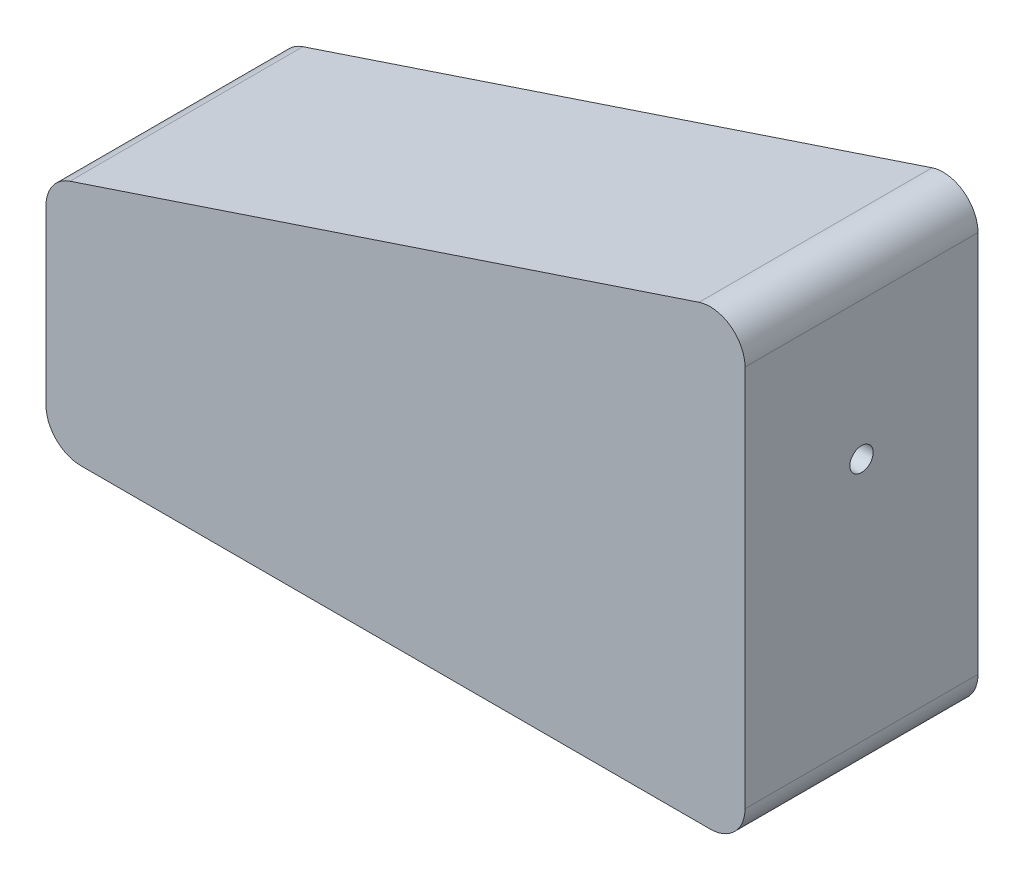
ISO-10303-21;
HEADER;
FILE_DESCRIPTION(('STEP AP214'),'2;1');
FILE_NAME('part.step','',(''),(''),'','','');
FILE_SCHEMA(('AUTOMOTIVE_DESIGN { 1 0 10303 214 1 1 1 1 }'));
ENDSEC;
DATA;
#1=APPLICATION_CONTEXT('core data for automotive mechanical design processes');
#2=APPLICATION_PROTOCOL_DEFINITION('international standard','automotive_design',2000,#1);
#3=PRODUCT_CONTEXT('',#1,'mechanical');
#4=PRODUCT('Part','Part','',(#3));
#5=PRODUCT_RELATED_PRODUCT_CATEGORY('part','',(#4));
#6=PRODUCT_DEFINITION_FORMATION('','',#4);
#7=PRODUCT_DEFINITION_CONTEXT('part definition',#1,'design');
#8=PRODUCT_DEFINITION('design','',#6,#7);
#9=PRODUCT_DEFINITION_SHAPE('','',#8);
#10=(LENGTH_UNIT() NAMED_UNIT(*) SI_UNIT(.MILLI.,.METRE.));
#11=(NAMED_UNIT(*) PLANE_ANGLE_UNIT() SI_UNIT($,.RADIAN.));
#12=(NAMED_UNIT(*) SI_UNIT($,.STERADIAN.) SOLID_ANGLE_UNIT());
#13=UNCERTAINTY_MEASURE_WITH_UNIT(LENGTH_MEASURE(1.E-05),#10,'distance_accuracy_value','');
#14=(GEOMETRIC_REPRESENTATION_CONTEXT(3) GLOBAL_UNCERTAINTY_ASSIGNED_CONTEXT((#13)) GLOBAL_UNIT_ASSIGNED_CONTEXT((#10,
#11,#12)) REPRESENTATION_CONTEXT('',''));
#15=CARTESIAN_POINT('',(0.,0.,0.));
#16=DIRECTION('',(0.,0.,1.));
#17=DIRECTION('',(1.,0.,0.));
#18=AXIS2_PLACEMENT_3D('',#15,#16,#17);
#19=CARTESIAN_POINT('',(0.,20.,20.));
#20=DIRECTION('',(1.,0.,0.));
#21=DIRECTION('',(0.,1.,0.));
#22=AXIS2_PLACEMENT_3D('',#19,#20,#21);
#23=PLANE('',#22);
#24=DIRECTION('',(0.,-1.,0.));
#25=VECTOR('',#24,1.);
#26=CARTESIAN_POINT('',(0.,20.,0.));
#27=LINE('',#26,#25);
#28=CARTESIAN_POINT('',(0.,17.8377223398316,0.));
#29=VERTEX_POINT('',#28);
#30=CARTESIAN_POINT('',(0.,3.,0.));
#31=VERTEX_POINT('',#30);
#32=EDGE_CURVE('E126',#29,#31,#27,.T.);
#33=ORIENTED_EDGE('',*,*,#32,.T.);
#34=DIRECTION('',(0.,0.,-1.));
#35=VECTOR('',#34,1.);
#36=CARTESIAN_POINT('',(0.,3.,20.));
#37=LINE('',#36,#35);
#38=CARTESIAN_POINT('',(0.,3.,20.));
#39=VERTEX_POINT('',#38);
#40=EDGE_CURVE('E104',#31,#39,#37,.F.);
#41=ORIENTED_EDGE('',*,*,#40,.T.);
#42=DIRECTION('',(0.,-1.,0.));
#43=VECTOR('',#42,1.);
#44=CARTESIAN_POINT('',(0.,20.,20.));
#45=LINE('',#44,#43);
#46=CARTESIAN_POINT('',(0.,17.8377223398316,20.));
#47=VERTEX_POINT('',#46);
#48=EDGE_CURVE('E136',#47,#39,#45,.T.);
#49=ORIENTED_EDGE('',*,*,#48,.F.);
#50=DIRECTION('',(0.,0.,-1.));
#51=VECTOR('',#50,1.);
#52=CARTESIAN_POINT('',(0.,17.8377223398316,20.));
#53=LINE('',#52,#51);
#54=EDGE_CURVE('E109',#47,#29,#53,.T.);
#55=ORIENTED_EDGE('',*,*,#54,.T.);
#56=EDGE_LOOP('',(#33,#41,#49,#55));
#57=FACE_BOUND('',#56,.T.);
#58=ADVANCED_FACE('F33',(#57),#23,.F.);
#59=CARTESIAN_POINT('',(0.,0.,20.));
#60=DIRECTION('',(0.,1.,0.));
#61=DIRECTION('',(0.,0.,1.));
#62=AXIS2_PLACEMENT_3D('',#59,#60,#61);
#63=PLANE('',#62);
#64=DIRECTION('',(1.,0.,0.));
#65=VECTOR('',#64,1.);
#66=CARTESIAN_POINT('',(0.,0.,20.));
#67=LINE('',#66,#65);
#68=CARTESIAN_POINT('',(3.,0.,20.));
#69=VERTEX_POINT('',#68);
#70=CARTESIAN_POINT('',(57.,0.,20.));
#71=VERTEX_POINT('',#70);
#72=EDGE_CURVE('E119',#69,#71,#67,.T.);
#73=ORIENTED_EDGE('',*,*,#72,.F.);
#74=DIRECTION('',(0.,0.,-1.));
#75=VECTOR('',#74,1.);
#76=CARTESIAN_POINT('',(3.,0.,20.));
#77=LINE('',#76,#75);
#78=CARTESIAN_POINT('',(3.,0.,0.));
#79=VERTEX_POINT('',#78);
#80=EDGE_CURVE('E103',#69,#79,#77,.T.);
#81=ORIENTED_EDGE('',*,*,#80,.T.);
#82=DIRECTION('',(1.,0.,0.));
#83=VECTOR('',#82,1.);
#84=CARTESIAN_POINT('',(0.,0.,0.));
#85=LINE('',#84,#83);
#86=CARTESIAN_POINT('',(57.,0.,0.));
#87=VERTEX_POINT('',#86);
#88=EDGE_CURVE('E116',#79,#87,#85,.T.);
#89=ORIENTED_EDGE('',*,*,#88,.T.);
#90=DIRECTION('',(0.,0.,-1.));
#91=VECTOR('',#90,1.);
#92=CARTESIAN_POINT('',(57.,0.,20.));
#93=LINE('',#92,#91);
#94=EDGE_CURVE('E121',#87,#71,#93,.F.);
#95=ORIENTED_EDGE('',*,*,#94,.T.);
#96=EDGE_LOOP('',(#73,#81,#89,#95));
#97=FACE_BOUND('',#96,.T.);
#98=ADVANCED_FACE('F115',(#97),#63,.F.);
#99=CARTESIAN_POINT('',(60.,0.,20.));
#100=DIRECTION('',(-1.,0.,0.));
#101=DIRECTION('',(0.,0.,1.));
#102=AXIS2_PLACEMENT_3D('',#99,#100,#101);
#103=PLANE('',#102);
#104=CARTESIAN_POINT('',(60.,24.,10.));
#105=DIRECTION('',(1.,0.,0.));
#106=DIRECTION('',(0.,0.,-1.));
#107=AXIS2_PLACEMENT_3D('',#104,#105,#106);
#108=CIRCLE('',#107,1.);
#109=CARTESIAN_POINT('',(60.,24.,9.));
#110=VERTEX_POINT('',#109);
#111=EDGE_CURVE('E176',#110,#110,#108,.T.);
#112=ORIENTED_EDGE('',*,*,#111,.F.);
#113=EDGE_LOOP('',(#112));
#114=FACE_BOUND('',#113,.T.);
#115=DIRECTION('',(0.,1.,0.));
#116=VECTOR('',#115,1.);
#117=CARTESIAN_POINT('',(60.,0.,20.));
#118=LINE('',#117,#116);
#119=CARTESIAN_POINT('',(60.,3.,20.));
#120=VERTEX_POINT('',#119);
#121=CARTESIAN_POINT('',(60.,35.8377223398316,20.));
#122=VERTEX_POINT('',#121);
#123=EDGE_CURVE('E162',#120,#122,#118,.T.);
#124=ORIENTED_EDGE('',*,*,#123,.F.);
#125=DIRECTION('',(0.,0.,-1.));
#126=VECTOR('',#125,1.);
#127=CARTESIAN_POINT('',(60.,3.,20.));
#128=LINE('',#127,#126);
#129=CARTESIAN_POINT('',(60.,3.,0.));
#130=VERTEX_POINT('',#129);
#131=EDGE_CURVE('E155',#120,#130,#128,.T.);
#132=ORIENTED_EDGE('',*,*,#131,.T.);
#133=DIRECTION('',(0.,1.,0.));
#134=VECTOR('',#133,1.);
#135=CARTESIAN_POINT('',(60.,0.,0.));
#136=LINE('',#135,#134);
#137=CARTESIAN_POINT('',(60.,35.8377223398316,0.));
#138=VERTEX_POINT('',#137);
#139=EDGE_CURVE('E125',#130,#138,#136,.T.);
#140=ORIENTED_EDGE('',*,*,#139,.T.);
#141=DIRECTION('',(0.,0.,-1.));
#142=VECTOR('',#141,1.);
#143=CARTESIAN_POINT('',(60.,35.8377223398316,20.));
#144=LINE('',#143,#142);
#145=EDGE_CURVE('E153',#138,#122,#144,.F.);
#146=ORIENTED_EDGE('',*,*,#145,.T.);
#147=EDGE_LOOP('',(#124,#132,#140,#146));
#148=FACE_BOUND('',#147,.T.);
#149=ADVANCED_FACE('F160',(#114,#148),#103,.F.);
#150=CARTESIAN_POINT('',(60.,40.,20.));
#151=DIRECTION('',(0.316227766016838,-0.948683298050514,0.));
#152=DIRECTION('',(0.948683298050514,0.316227766016838,0.));
#153=AXIS2_PLACEMENT_3D('',#150,#151,#152);
#154=PLANE('',#153);
#155=DIRECTION('',(-0.948683298050514,-0.316227766016838,0.));
#156=VECTOR('',#155,1.);
#157=CARTESIAN_POINT('',(60.,40.,20.));
#158=LINE('',#157,#156);
#159=CARTESIAN_POINT('',(56.0513167019495,38.6837722339832,20.));
#160=VERTEX_POINT('',#159);
#161=CARTESIAN_POINT('',(2.05131670194948,20.6837722339832,20.));
#162=VERTEX_POINT('',#161);
#163=EDGE_CURVE('E137',#160,#162,#158,.T.);
#164=ORIENTED_EDGE('',*,*,#163,.F.);
#165=DIRECTION('',(0.,0.,-1.));
#166=VECTOR('',#165,1.);
#167=CARTESIAN_POINT('',(56.0513167019495,38.6837722339832,20.));
#168=LINE('',#167,#166);
#169=CARTESIAN_POINT('',(56.0513167019495,38.6837722339832,0.));
#170=VERTEX_POINT('',#169);
#171=EDGE_CURVE('E11',#160,#170,#168,.T.);
#172=ORIENTED_EDGE('',*,*,#171,.T.);
#173=DIRECTION('',(-0.948683298050514,-0.316227766016838,0.));
#174=VECTOR('',#173,1.);
#175=CARTESIAN_POINT('',(60.,40.,0.));
#176=LINE('',#175,#174);
#177=CARTESIAN_POINT('',(2.05131670194948,20.6837722339832,0.));
#178=VERTEX_POINT('',#177);
#179=EDGE_CURVE('E129',#170,#178,#176,.T.);
#180=ORIENTED_EDGE('',*,*,#179,.T.);
#181=DIRECTION('',(0.,0.,-1.));
#182=VECTOR('',#181,1.);
#183=CARTESIAN_POINT('',(2.0513167019495,20.6837722339832,20.));
#184=LINE('',#183,#182);
#185=EDGE_CURVE('E41',#178,#162,#184,.F.);
#186=ORIENTED_EDGE('',*,*,#185,.T.);
#187=EDGE_LOOP('',(#164,#172,#180,#186));
#188=FACE_BOUND('',#187,.T.);
#189=ADVANCED_FACE('F169',(#188),#154,.F.);
#190=CARTESIAN_POINT('',(0.,0.,20.));
#191=DIRECTION('',(0.,0.,1.));
#192=DIRECTION('',(1.,0.,0.));
#193=AXIS2_PLACEMENT_3D('',#190,#191,#192);
#194=PLANE('',#193);
#195=ORIENTED_EDGE('',*,*,#48,.T.);
#196=CARTESIAN_POINT('',(3.,3.,20.));
#197=DIRECTION('',(0.,0.,1.));
#198=DIRECTION('',(1.,0.,0.));
#199=AXIS2_PLACEMENT_3D('',#196,#197,#198);
#200=CIRCLE('',#199,3.);
#201=EDGE_CURVE('E151',#39,#69,#200,.T.);
#202=ORIENTED_EDGE('',*,*,#201,.T.);
#203=ORIENTED_EDGE('',*,*,#72,.T.);
#204=CARTESIAN_POINT('',(57.,3.,20.));
#205=DIRECTION('',(0.,0.,1.));
#206=DIRECTION('',(1.,0.,0.));
#207=AXIS2_PLACEMENT_3D('',#204,#205,#206);
#208=CIRCLE('',#207,3.);
#209=EDGE_CURVE('E149',#71,#120,#208,.T.);
#210=ORIENTED_EDGE('',*,*,#209,.T.);
#211=ORIENTED_EDGE('',*,*,#123,.T.);
#212=CARTESIAN_POINT('',(57.,35.8377223398316,20.));
#213=DIRECTION('',(0.,0.,1.));
#214=DIRECTION('',(1.,0.,0.));
#215=AXIS2_PLACEMENT_3D('',#212,#213,#214);
#216=CIRCLE('',#215,3.);
#217=EDGE_CURVE('E54',#122,#160,#216,.T.);
#218=ORIENTED_EDGE('',*,*,#217,.T.);
#219=ORIENTED_EDGE('',*,*,#163,.T.);
#220=CARTESIAN_POINT('',(3.,17.8377223398316,20.));
#221=DIRECTION('',(0.,0.,1.));
#222=DIRECTION('',(1.,0.,0.));
#223=AXIS2_PLACEMENT_3D('',#220,#221,#222);
#224=CIRCLE('',#223,3.);
#225=EDGE_CURVE('E146',#162,#47,#224,.T.);
#226=ORIENTED_EDGE('',*,*,#225,.T.);
#227=EDGE_LOOP('',(#195,#202,#203,#210,#211,#218,#219,#226));
#228=FACE_BOUND('',#227,.T.);
#229=ADVANCED_FACE('F197',(#228),#194,.T.);
#230=CARTESIAN_POINT('',(0.,0.,0.));
#231=DIRECTION('',(0.,0.,1.));
#232=DIRECTION('',(1.,0.,0.));
#233=AXIS2_PLACEMENT_3D('',#230,#231,#232);
#234=PLANE('',#233);
#235=ORIENTED_EDGE('',*,*,#88,.F.);
#236=CARTESIAN_POINT('',(3.,3.,0.));
#237=DIRECTION('',(0.,0.,1.));
#238=DIRECTION('',(1.,0.,0.));
#239=AXIS2_PLACEMENT_3D('',#236,#237,#238);
#240=CIRCLE('',#239,3.);
#241=EDGE_CURVE('E99',#79,#31,#240,.F.);
#242=ORIENTED_EDGE('',*,*,#241,.T.);
#243=ORIENTED_EDGE('',*,*,#32,.F.);
#244=CARTESIAN_POINT('',(3.,17.8377223398316,0.));
#245=DIRECTION('',(0.,0.,1.));
#246=DIRECTION('',(1.,0.,0.));
#247=AXIS2_PLACEMENT_3D('',#244,#245,#246);
#248=CIRCLE('',#247,3.);
#249=EDGE_CURVE('E120',#29,#178,#248,.F.);
#250=ORIENTED_EDGE('',*,*,#249,.T.);
#251=ORIENTED_EDGE('',*,*,#179,.F.);
#252=CARTESIAN_POINT('',(57.,35.8377223398316,0.));
#253=DIRECTION('',(0.,0.,1.));
#254=DIRECTION('',(1.,0.,0.));
#255=AXIS2_PLACEMENT_3D('',#252,#253,#254);
#256=CIRCLE('',#255,3.);
#257=EDGE_CURVE('E140',#170,#138,#256,.F.);
#258=ORIENTED_EDGE('',*,*,#257,.T.);
#259=ORIENTED_EDGE('',*,*,#139,.F.);
#260=CARTESIAN_POINT('',(57.,3.,0.));
#261=DIRECTION('',(0.,0.,1.));
#262=DIRECTION('',(1.,0.,0.));
#263=AXIS2_PLACEMENT_3D('',#260,#261,#262);
#264=CIRCLE('',#263,3.);
#265=EDGE_CURVE('E110',#130,#87,#264,.F.);
#266=ORIENTED_EDGE('',*,*,#265,.T.);
#267=EDGE_LOOP('',(#235,#242,#243,#250,#251,#258,#259,#266));
#268=FACE_BOUND('',#267,.T.);
#269=ADVANCED_FACE('F123',(#268),#234,.F.);
#270=CARTESIAN_POINT('',(3.,3.,20.));
#271=DIRECTION('',(0.,0.,-1.));
#272=DIRECTION('',(-1.,0.,0.));
#273=AXIS2_PLACEMENT_3D('',#270,#271,#272);
#274=CYLINDRICAL_SURFACE('',#273,3.);
#275=ORIENTED_EDGE('',*,*,#201,.F.);
#276=ORIENTED_EDGE('',*,*,#40,.F.);
#277=ORIENTED_EDGE('',*,*,#241,.F.);
#278=ORIENTED_EDGE('',*,*,#80,.F.);
#279=EDGE_LOOP('',(#275,#276,#277,#278));
#280=FACE_BOUND('',#279,.T.);
#281=ADVANCED_FACE('F102',(#280),#274,.T.);
#282=CARTESIAN_POINT('',(57.,3.,20.));
#283=DIRECTION('',(0.,0.,-1.));
#284=DIRECTION('',(-1.,0.,0.));
#285=AXIS2_PLACEMENT_3D('',#282,#283,#284);
#286=CYLINDRICAL_SURFACE('',#285,3.);
#287=ORIENTED_EDGE('',*,*,#209,.F.);
#288=ORIENTED_EDGE('',*,*,#94,.F.);
#289=ORIENTED_EDGE('',*,*,#265,.F.);
#290=ORIENTED_EDGE('',*,*,#131,.F.);
#291=EDGE_LOOP('',(#287,#288,#289,#290));
#292=FACE_BOUND('',#291,.T.);
#293=ADVANCED_FACE('F209',(#292),#286,.T.);
#294=CARTESIAN_POINT('',(57.,35.8377223398316,20.));
#295=DIRECTION('',(0.,0.,-1.));
#296=DIRECTION('',(-1.,0.,0.));
#297=AXIS2_PLACEMENT_3D('',#294,#295,#296);
#298=CYLINDRICAL_SURFACE('',#297,3.);
#299=ORIENTED_EDGE('',*,*,#217,.F.);
#300=ORIENTED_EDGE('',*,*,#145,.F.);
#301=ORIENTED_EDGE('',*,*,#257,.F.);
#302=ORIENTED_EDGE('',*,*,#171,.F.);
#303=EDGE_LOOP('',(#299,#300,#301,#302));
#304=FACE_BOUND('',#303,.T.);
#305=ADVANCED_FACE('F168',(#304),#298,.T.);
#306=CARTESIAN_POINT('',(3.,17.8377223398316,20.));
#307=DIRECTION('',(0.,0.,-1.));
#308=DIRECTION('',(-1.,0.,0.));
#309=AXIS2_PLACEMENT_3D('',#306,#307,#308);
#310=CYLINDRICAL_SURFACE('',#309,3.);
#311=ORIENTED_EDGE('',*,*,#225,.F.);
#312=ORIENTED_EDGE('',*,*,#185,.F.);
#313=ORIENTED_EDGE('',*,*,#249,.F.);
#314=ORIENTED_EDGE('',*,*,#54,.F.);
#315=EDGE_LOOP('',(#311,#312,#313,#314));
#316=FACE_BOUND('',#315,.T.);
#317=ADVANCED_FACE('F35',(#316),#310,.T.);
#318=CARTESIAN_POINT('',(50.,24.,10.));
#319=DIRECTION('',(1.,0.,0.));
#320=DIRECTION('',(0.,0.,-1.));
#321=AXIS2_PLACEMENT_3D('',#318,#319,#320);
#322=CYLINDRICAL_SURFACE('',#321,1.);
#323=CARTESIAN_POINT('',(50.,24.,10.));
#324=DIRECTION('',(1.,0.,0.));
#325=DIRECTION('',(0.,0.,-1.));
#326=AXIS2_PLACEMENT_3D('',#323,#324,#325);
#327=CIRCLE('',#326,1.);
#328=CARTESIAN_POINT('',(50.,24.,9.));
#329=VERTEX_POINT('',#328);
#330=EDGE_CURVE('E131',#329,#329,#327,.T.);
#331=ORIENTED_EDGE('',*,*,#330,.F.);
#332=EDGE_LOOP('',(#331));
#333=FACE_BOUND('',#332,.T.);
#334=ORIENTED_EDGE('',*,*,#111,.T.);
#335=EDGE_LOOP('',(#334));
#336=FACE_BOUND('',#335,.T.);
#337=ADVANCED_FACE('F184',(#333,#336),#322,.F.);
#338=CARTESIAN_POINT('',(50.,24.,10.));
#339=DIRECTION('',(1.,0.,0.));
#340=DIRECTION('',(0.,0.,-1.));
#341=AXIS2_PLACEMENT_3D('',#338,#339,#340);
#342=PLANE('',#341);
#343=ORIENTED_EDGE('',*,*,#330,.T.);
#344=EDGE_LOOP('',(#343));
#345=FACE_BOUND('',#344,.T.);
#346=ADVANCED_FACE('F182',(#345),#342,.T.);
#347=CLOSED_SHELL('',(#58,#98,#149,#189,#229,#269,#281,#293,#305,#317,#337,#346));
#348=MANIFOLD_SOLID_BREP('B2',#347);
#349=ADVANCED_BREP_SHAPE_REPRESENTATION('',(#18,#348),#14);
#350=SHAPE_DEFINITION_REPRESENTATION(#9,#349);
ENDSEC;
END-ISO-10303-21;
